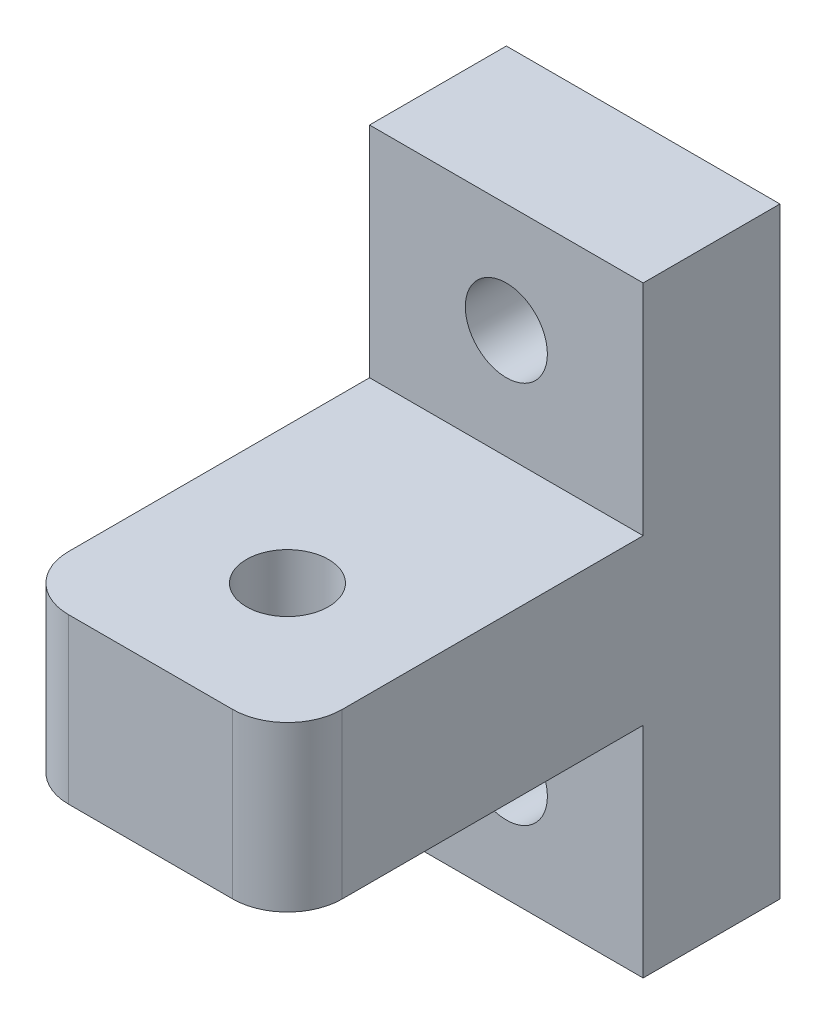
ISO-10303-21;
HEADER;
FILE_DESCRIPTION(('STEP AP214'),'2;1');
FILE_NAME('part.step','',(''),(''),'','','');
FILE_SCHEMA(('AUTOMOTIVE_DESIGN { 1 0 10303 214 1 1 1 1 }'));
ENDSEC;
DATA;
#1=APPLICATION_CONTEXT('core data for automotive mechanical design processes');
#2=APPLICATION_PROTOCOL_DEFINITION('international standard','automotive_design',2000,#1);
#3=PRODUCT_CONTEXT('',#1,'mechanical');
#4=PRODUCT('Part','Part','',(#3));
#5=PRODUCT_RELATED_PRODUCT_CATEGORY('part','',(#4));
#6=PRODUCT_DEFINITION_FORMATION('','',#4);
#7=PRODUCT_DEFINITION_CONTEXT('part definition',#1,'design');
#8=PRODUCT_DEFINITION('design','',#6,#7);
#9=PRODUCT_DEFINITION_SHAPE('','',#8);
#10=(LENGTH_UNIT() NAMED_UNIT(*) SI_UNIT(.MILLI.,.METRE.));
#11=(NAMED_UNIT(*) PLANE_ANGLE_UNIT() SI_UNIT($,.RADIAN.));
#12=(NAMED_UNIT(*) SI_UNIT($,.STERADIAN.) SOLID_ANGLE_UNIT());
#13=UNCERTAINTY_MEASURE_WITH_UNIT(LENGTH_MEASURE(1.E-05),#10,'distance_accuracy_value','');
#14=(GEOMETRIC_REPRESENTATION_CONTEXT(3) GLOBAL_UNCERTAINTY_ASSIGNED_CONTEXT((#13)) GLOBAL_UNIT_ASSIGNED_CONTEXT((#10,
#11,#12)) REPRESENTATION_CONTEXT('',''));
#15=CARTESIAN_POINT('',(0.,0.,0.));
#16=DIRECTION('',(0.,0.,1.));
#17=DIRECTION('',(1.,0.,0.));
#18=AXIS2_PLACEMENT_3D('',#15,#16,#17);
#19=CARTESIAN_POINT('',(0.,0.,5.));
#20=DIRECTION('',(0.,0.,-1.));
#21=DIRECTION('',(-1.,0.,0.));
#22=AXIS2_PLACEMENT_3D('',#19,#20,#21);
#23=PLANE('',#22);
#24=CARTESIAN_POINT('',(0.,-7.,5.));
#25=DIRECTION('',(0.,0.,1.));
#26=DIRECTION('',(1.,0.,0.));
#27=AXIS2_PLACEMENT_3D('',#24,#25,#26);
#28=CIRCLE('',#27,1.5);
#29=CARTESIAN_POINT('',(1.5,-7.,5.));
#30=VERTEX_POINT('',#29);
#31=EDGE_CURVE('E190',#30,#30,#28,.T.);
#32=ORIENTED_EDGE('',*,*,#31,.F.);
#33=EDGE_LOOP('',(#32));
#34=FACE_BOUND('',#33,.T.);
#35=DIRECTION('',(1.,0.,0.));
#36=VECTOR('',#35,1.);
#37=CARTESIAN_POINT('',(-5.,-3.,5.));
#38=LINE('',#37,#36);
#39=CARTESIAN_POINT('',(-5.,-3.,5.));
#40=VERTEX_POINT('',#39);
#41=CARTESIAN_POINT('',(5.,-3.,5.));
#42=VERTEX_POINT('',#41);
#43=EDGE_CURVE('E133',#40,#42,#38,.T.);
#44=ORIENTED_EDGE('',*,*,#43,.F.);
#45=DIRECTION('',(0.,-1.,0.));
#46=VECTOR('',#45,1.);
#47=CARTESIAN_POINT('',(-5.,-11.,5.));
#48=LINE('',#47,#46);
#49=CARTESIAN_POINT('',(-5.,-11.,5.));
#50=VERTEX_POINT('',#49);
#51=EDGE_CURVE('E130',#40,#50,#48,.T.);
#52=ORIENTED_EDGE('',*,*,#51,.T.);
#53=DIRECTION('',(1.,0.,0.));
#54=VECTOR('',#53,1.);
#55=CARTESIAN_POINT('',(-5.,-11.,5.));
#56=LINE('',#55,#54);
#57=CARTESIAN_POINT('',(5.,-11.,5.));
#58=VERTEX_POINT('',#57);
#59=EDGE_CURVE('E129',#50,#58,#56,.T.);
#60=ORIENTED_EDGE('',*,*,#59,.T.);
#61=DIRECTION('',(0.,1.,0.));
#62=VECTOR('',#61,1.);
#63=CARTESIAN_POINT('',(5.,-11.,5.));
#64=LINE('',#63,#62);
#65=EDGE_CURVE('E151',#58,#42,#64,.T.);
#66=ORIENTED_EDGE('',*,*,#65,.T.);
#67=EDGE_LOOP('',(#44,#52,#60,#66));
#68=FACE_BOUND('',#67,.T.);
#69=ADVANCED_FACE('F34',(#34,#68),#23,.F.);
#70=CARTESIAN_POINT('',(0.,7.,5.));
#71=DIRECTION('',(0.,0.,1.));
#72=DIRECTION('',(1.,0.,0.));
#73=AXIS2_PLACEMENT_3D('',#70,#71,#72);
#74=CIRCLE('',#73,1.5);
#75=CARTESIAN_POINT('',(1.5,7.,5.));
#76=VERTEX_POINT('',#75);
#77=EDGE_CURVE('E200',#76,#76,#74,.T.);
#78=ORIENTED_EDGE('',*,*,#77,.F.);
#79=EDGE_LOOP('',(#78));
#80=FACE_BOUND('',#79,.T.);
#81=DIRECTION('',(-1.,0.,0.));
#82=VECTOR('',#81,1.);
#83=CARTESIAN_POINT('',(-5.,3.,5.));
#84=LINE('',#83,#82);
#85=CARTESIAN_POINT('',(5.,3.,5.));
#86=VERTEX_POINT('',#85);
#87=CARTESIAN_POINT('',(-5.,3.,5.));
#88=VERTEX_POINT('',#87);
#89=EDGE_CURVE('E124',#86,#88,#84,.T.);
#90=ORIENTED_EDGE('',*,*,#89,.F.);
#91=CARTESIAN_POINT('',(5.,11.,5.));
#92=VERTEX_POINT('',#91);
#93=EDGE_CURVE('E154',#86,#92,#64,.T.);
#94=ORIENTED_EDGE('',*,*,#93,.T.);
#95=DIRECTION('',(-1.,0.,0.));
#96=VECTOR('',#95,1.);
#97=CARTESIAN_POINT('',(-5.,11.,5.));
#98=LINE('',#97,#96);
#99=CARTESIAN_POINT('',(-5.,11.,5.));
#100=VERTEX_POINT('',#99);
#101=EDGE_CURVE('E127',#92,#100,#98,.T.);
#102=ORIENTED_EDGE('',*,*,#101,.T.);
#103=EDGE_CURVE('E115',#100,#88,#48,.T.);
#104=ORIENTED_EDGE('',*,*,#103,.T.);
#105=EDGE_LOOP('',(#90,#94,#102,#104));
#106=FACE_BOUND('',#105,.T.);
#107=ADVANCED_FACE('F123',(#80,#106),#23,.F.);
#108=CARTESIAN_POINT('',(5.,-11.,5.));
#109=DIRECTION('',(-1.,0.,0.));
#110=DIRECTION('',(0.,0.,1.));
#111=AXIS2_PLACEMENT_3D('',#108,#109,#110);
#112=PLANE('',#111);
#113=DIRECTION('',(0.,0.,-1.));
#114=VECTOR('',#113,1.);
#115=CARTESIAN_POINT('',(5.,3.,18.));
#116=LINE('',#115,#114);
#117=CARTESIAN_POINT('',(5.,3.,16.));
#118=VERTEX_POINT('',#117);
#119=EDGE_CURVE('E118',#118,#86,#116,.T.);
#120=ORIENTED_EDGE('',*,*,#119,.F.);
#121=DIRECTION('',(0.,1.,0.));
#122=VECTOR('',#121,1.);
#123=CARTESIAN_POINT('',(5.,-11.,16.));
#124=LINE('',#123,#122);
#125=CARTESIAN_POINT('',(5.,-3.,16.));
#126=VERTEX_POINT('',#125);
#127=EDGE_CURVE('E11',#118,#126,#124,.F.);
#128=ORIENTED_EDGE('',*,*,#127,.T.);
#129=DIRECTION('',(0.,0.,-1.));
#130=VECTOR('',#129,1.);
#131=CARTESIAN_POINT('',(5.,-3.,18.));
#132=LINE('',#131,#130);
#133=EDGE_CURVE('E146',#126,#42,#132,.T.);
#134=ORIENTED_EDGE('',*,*,#133,.T.);
#135=ORIENTED_EDGE('',*,*,#65,.F.);
#136=DIRECTION('',(0.,0.,-1.));
#137=VECTOR('',#136,1.);
#138=CARTESIAN_POINT('',(5.,-11.,5.));
#139=LINE('',#138,#137);
#140=CARTESIAN_POINT('',(5.,-11.,0.));
#141=VERTEX_POINT('',#140);
#142=EDGE_CURVE('E157',#58,#141,#139,.T.);
#143=ORIENTED_EDGE('',*,*,#142,.T.);
#144=DIRECTION('',(0.,1.,0.));
#145=VECTOR('',#144,1.);
#146=CARTESIAN_POINT('',(5.,-11.,0.));
#147=LINE('',#146,#145);
#148=CARTESIAN_POINT('',(5.,11.,0.));
#149=VERTEX_POINT('',#148);
#150=EDGE_CURVE('E150',#141,#149,#147,.T.);
#151=ORIENTED_EDGE('',*,*,#150,.T.);
#152=DIRECTION('',(0.,0.,-1.));
#153=VECTOR('',#152,1.);
#154=CARTESIAN_POINT('',(5.,11.,5.));
#155=LINE('',#154,#153);
#156=EDGE_CURVE('E173',#92,#149,#155,.T.);
#157=ORIENTED_EDGE('',*,*,#156,.F.);
#158=ORIENTED_EDGE('',*,*,#93,.F.);
#159=EDGE_LOOP('',(#120,#128,#134,#135,#143,#151,#157,#158));
#160=FACE_BOUND('',#159,.T.);
#161=ADVANCED_FACE('F215',(#160),#112,.F.);
#162=CARTESIAN_POINT('',(-5.,11.,5.));
#163=DIRECTION('',(0.,-1.,0.));
#164=DIRECTION('',(0.,0.,-1.));
#165=AXIS2_PLACEMENT_3D('',#162,#163,#164);
#166=PLANE('',#165);
#167=DIRECTION('',(-1.,0.,0.));
#168=VECTOR('',#167,1.);
#169=CARTESIAN_POINT('',(-5.,11.,0.));
#170=LINE('',#169,#168);
#171=CARTESIAN_POINT('',(-5.,11.,0.));
#172=VERTEX_POINT('',#171);
#173=EDGE_CURVE('E160',#149,#172,#170,.T.);
#174=ORIENTED_EDGE('',*,*,#173,.T.);
#175=DIRECTION('',(0.,0.,-1.));
#176=VECTOR('',#175,1.);
#177=CARTESIAN_POINT('',(-5.,11.,5.));
#178=LINE('',#177,#176);
#179=EDGE_CURVE('E171',#100,#172,#178,.T.);
#180=ORIENTED_EDGE('',*,*,#179,.F.);
#181=ORIENTED_EDGE('',*,*,#101,.F.);
#182=ORIENTED_EDGE('',*,*,#156,.T.);
#183=EDGE_LOOP('',(#174,#180,#181,#182));
#184=FACE_BOUND('',#183,.T.);
#185=ADVANCED_FACE('F233',(#184),#166,.F.);
#186=CARTESIAN_POINT('',(-5.,-11.,5.));
#187=DIRECTION('',(1.,0.,0.));
#188=DIRECTION('',(0.,0.,-1.));
#189=AXIS2_PLACEMENT_3D('',#186,#187,#188);
#190=PLANE('',#189);
#191=DIRECTION('',(0.,0.,-1.));
#192=VECTOR('',#191,1.);
#193=CARTESIAN_POINT('',(-5.,-3.,18.));
#194=LINE('',#193,#192);
#195=CARTESIAN_POINT('',(-5.,-3.,16.));
#196=VERTEX_POINT('',#195);
#197=EDGE_CURVE('E119',#196,#40,#194,.T.);
#198=ORIENTED_EDGE('',*,*,#197,.F.);
#199=DIRECTION('',(0.,-1.,0.));
#200=VECTOR('',#199,1.);
#201=CARTESIAN_POINT('',(-5.,-11.,16.));
#202=LINE('',#201,#200);
#203=CARTESIAN_POINT('',(-5.,3.,16.));
#204=VERTEX_POINT('',#203);
#205=EDGE_CURVE('E59',#196,#204,#202,.F.);
#206=ORIENTED_EDGE('',*,*,#205,.T.);
#207=DIRECTION('',(0.,0.,-1.));
#208=VECTOR('',#207,1.);
#209=CARTESIAN_POINT('',(-5.,3.,18.));
#210=LINE('',#209,#208);
#211=EDGE_CURVE('E111',#204,#88,#210,.T.);
#212=ORIENTED_EDGE('',*,*,#211,.T.);
#213=ORIENTED_EDGE('',*,*,#103,.F.);
#214=ORIENTED_EDGE('',*,*,#179,.T.);
#215=DIRECTION('',(0.,-1.,0.));
#216=VECTOR('',#215,1.);
#217=CARTESIAN_POINT('',(-5.,-11.,0.));
#218=LINE('',#217,#216);
#219=CARTESIAN_POINT('',(-5.,-11.,0.));
#220=VERTEX_POINT('',#219);
#221=EDGE_CURVE('E162',#172,#220,#218,.T.);
#222=ORIENTED_EDGE('',*,*,#221,.T.);
#223=DIRECTION('',(0.,0.,-1.));
#224=VECTOR('',#223,1.);
#225=CARTESIAN_POINT('',(-5.,-11.,5.));
#226=LINE('',#225,#224);
#227=EDGE_CURVE('E168',#50,#220,#226,.T.);
#228=ORIENTED_EDGE('',*,*,#227,.F.);
#229=ORIENTED_EDGE('',*,*,#51,.F.);
#230=EDGE_LOOP('',(#198,#206,#212,#213,#214,#222,#228,#229));
#231=FACE_BOUND('',#230,.T.);
#232=ADVANCED_FACE('F113',(#231),#190,.F.);
#233=CARTESIAN_POINT('',(-5.,-11.,5.));
#234=DIRECTION('',(0.,1.,0.));
#235=DIRECTION('',(0.,0.,1.));
#236=AXIS2_PLACEMENT_3D('',#233,#234,#235);
#237=PLANE('',#236);
#238=DIRECTION('',(1.,0.,0.));
#239=VECTOR('',#238,1.);
#240=CARTESIAN_POINT('',(-5.,-11.,0.));
#241=LINE('',#240,#239);
#242=EDGE_CURVE('E164',#220,#141,#241,.T.);
#243=ORIENTED_EDGE('',*,*,#242,.T.);
#244=ORIENTED_EDGE('',*,*,#142,.F.);
#245=ORIENTED_EDGE('',*,*,#59,.F.);
#246=ORIENTED_EDGE('',*,*,#227,.T.);
#247=EDGE_LOOP('',(#243,#244,#245,#246));
#248=FACE_BOUND('',#247,.T.);
#249=ADVANCED_FACE('F227',(#248),#237,.F.);
#250=CARTESIAN_POINT('',(0.,0.,0.));
#251=DIRECTION('',(0.,0.,-1.));
#252=DIRECTION('',(-1.,0.,0.));
#253=AXIS2_PLACEMENT_3D('',#250,#251,#252);
#254=PLANE('',#253);
#255=CARTESIAN_POINT('',(0.,7.,0.));
#256=DIRECTION('',(0.,0.,-1.));
#257=DIRECTION('',(-1.,0.,0.));
#258=AXIS2_PLACEMENT_3D('',#255,#256,#257);
#259=CIRCLE('',#258,1.5);
#260=CARTESIAN_POINT('',(1.5,7.,0.));
#261=VERTEX_POINT('',#260);
#262=EDGE_CURVE('E38',#261,#261,#259,.T.);
#263=ORIENTED_EDGE('',*,*,#262,.F.);
#264=EDGE_LOOP('',(#263));
#265=FACE_BOUND('',#264,.T.);
#266=CARTESIAN_POINT('',(0.,-7.,0.));
#267=DIRECTION('',(0.,0.,-1.));
#268=DIRECTION('',(-1.,0.,0.));
#269=AXIS2_PLACEMENT_3D('',#266,#267,#268);
#270=CIRCLE('',#269,1.5);
#271=CARTESIAN_POINT('',(1.5,-7.,0.));
#272=VERTEX_POINT('',#271);
#273=EDGE_CURVE('E188',#272,#272,#270,.T.);
#274=ORIENTED_EDGE('',*,*,#273,.F.);
#275=EDGE_LOOP('',(#274));
#276=FACE_BOUND('',#275,.T.);
#277=ORIENTED_EDGE('',*,*,#150,.F.);
#278=ORIENTED_EDGE('',*,*,#242,.F.);
#279=ORIENTED_EDGE('',*,*,#221,.F.);
#280=ORIENTED_EDGE('',*,*,#173,.F.);
#281=EDGE_LOOP('',(#277,#278,#279,#280));
#282=FACE_BOUND('',#281,.T.);
#283=ADVANCED_FACE('F231',(#265,#276,#282),#254,.T.);
#284=CARTESIAN_POINT('',(-5.,3.,18.));
#285=DIRECTION('',(0.,-1.,0.));
#286=DIRECTION('',(0.,0.,-1.));
#287=AXIS2_PLACEMENT_3D('',#284,#285,#286);
#288=PLANE('',#287);
#289=CARTESIAN_POINT('',(0.,3.,13.));
#290=DIRECTION('',(0.,-1.,0.));
#291=DIRECTION('',(0.,0.,-1.));
#292=AXIS2_PLACEMENT_3D('',#289,#290,#291);
#293=CIRCLE('',#292,1.5);
#294=CARTESIAN_POINT('',(0.,3.,11.5));
#295=VERTEX_POINT('',#294);
#296=EDGE_CURVE('E134',#295,#295,#293,.T.);
#297=ORIENTED_EDGE('',*,*,#296,.T.);
#298=EDGE_LOOP('',(#297));
#299=FACE_BOUND('',#298,.T.);
#300=ORIENTED_EDGE('',*,*,#211,.F.);
#301=CARTESIAN_POINT('',(-3.,3.,16.));
#302=DIRECTION('',(0.,-1.,0.));
#303=DIRECTION('',(0.,0.,-1.));
#304=AXIS2_PLACEMENT_3D('',#301,#302,#303);
#305=CIRCLE('',#304,2.);
#306=CARTESIAN_POINT('',(-3.,3.,18.));
#307=VERTEX_POINT('',#306);
#308=EDGE_CURVE('E43',#204,#307,#305,.F.);
#309=ORIENTED_EDGE('',*,*,#308,.T.);
#310=DIRECTION('',(-1.,0.,0.));
#311=VECTOR('',#310,1.);
#312=CARTESIAN_POINT('',(-5.,3.,18.));
#313=LINE('',#312,#311);
#314=CARTESIAN_POINT('',(3.,3.,18.));
#315=VERTEX_POINT('',#314);
#316=EDGE_CURVE('E137',#315,#307,#313,.T.);
#317=ORIENTED_EDGE('',*,*,#316,.F.);
#318=CARTESIAN_POINT('',(3.,3.,16.));
#319=DIRECTION('',(0.,-1.,0.));
#320=DIRECTION('',(0.,0.,-1.));
#321=AXIS2_PLACEMENT_3D('',#318,#319,#320);
#322=CIRCLE('',#321,2.);
#323=EDGE_CURVE('E51',#315,#118,#322,.F.);
#324=ORIENTED_EDGE('',*,*,#323,.T.);
#325=ORIENTED_EDGE('',*,*,#119,.T.);
#326=ORIENTED_EDGE('',*,*,#89,.T.);
#327=EDGE_LOOP('',(#300,#309,#317,#324,#325,#326));
#328=FACE_BOUND('',#327,.T.);
#329=ADVANCED_FACE('F132',(#299,#328),#288,.F.);
#330=CARTESIAN_POINT('',(-5.,-3.,18.));
#331=DIRECTION('',(0.,1.,0.));
#332=DIRECTION('',(0.,0.,1.));
#333=AXIS2_PLACEMENT_3D('',#330,#331,#332);
#334=PLANE('',#333);
#335=CARTESIAN_POINT('',(0.,-3.,13.));
#336=DIRECTION('',(0.,-1.,0.));
#337=DIRECTION('',(0.,0.,-1.));
#338=AXIS2_PLACEMENT_3D('',#335,#336,#337);
#339=CIRCLE('',#338,1.5);
#340=CARTESIAN_POINT('',(0.,-3.,11.5));
#341=VERTEX_POINT('',#340);
#342=EDGE_CURVE('E140',#341,#341,#339,.T.);
#343=ORIENTED_EDGE('',*,*,#342,.F.);
#344=EDGE_LOOP('',(#343));
#345=FACE_BOUND('',#344,.T.);
#346=DIRECTION('',(1.,0.,0.));
#347=VECTOR('',#346,1.);
#348=CARTESIAN_POINT('',(-5.,-3.,18.));
#349=LINE('',#348,#347);
#350=CARTESIAN_POINT('',(-3.,-3.,18.));
#351=VERTEX_POINT('',#350);
#352=CARTESIAN_POINT('',(3.,-3.,18.));
#353=VERTEX_POINT('',#352);
#354=EDGE_CURVE('E143',#351,#353,#349,.T.);
#355=ORIENTED_EDGE('',*,*,#354,.F.);
#356=CARTESIAN_POINT('',(-3.,-3.,16.));
#357=DIRECTION('',(0.,1.,0.));
#358=DIRECTION('',(0.,0.,1.));
#359=AXIS2_PLACEMENT_3D('',#356,#357,#358);
#360=CIRCLE('',#359,2.);
#361=EDGE_CURVE('E184',#351,#196,#360,.F.);
#362=ORIENTED_EDGE('',*,*,#361,.T.);
#363=ORIENTED_EDGE('',*,*,#197,.T.);
#364=ORIENTED_EDGE('',*,*,#43,.T.);
#365=ORIENTED_EDGE('',*,*,#133,.F.);
#366=CARTESIAN_POINT('',(3.,-3.,16.));
#367=DIRECTION('',(0.,1.,0.));
#368=DIRECTION('',(0.,0.,1.));
#369=AXIS2_PLACEMENT_3D('',#366,#367,#368);
#370=CIRCLE('',#369,2.);
#371=EDGE_CURVE('E182',#126,#353,#370,.F.);
#372=ORIENTED_EDGE('',*,*,#371,.T.);
#373=EDGE_LOOP('',(#355,#362,#363,#364,#365,#372));
#374=FACE_BOUND('',#373,.T.);
#375=ADVANCED_FACE('F217',(#345,#374),#334,.F.);
#376=CARTESIAN_POINT('',(0.,0.,18.));
#377=DIRECTION('',(0.,0.,-1.));
#378=DIRECTION('',(-1.,0.,0.));
#379=AXIS2_PLACEMENT_3D('',#376,#377,#378);
#380=PLANE('',#379);
#381=ORIENTED_EDGE('',*,*,#316,.T.);
#382=DIRECTION('',(0.,-1.,0.));
#383=VECTOR('',#382,1.);
#384=CARTESIAN_POINT('',(-3.,0.,18.));
#385=LINE('',#384,#383);
#386=EDGE_CURVE('E179',#307,#351,#385,.T.);
#387=ORIENTED_EDGE('',*,*,#386,.T.);
#388=ORIENTED_EDGE('',*,*,#354,.T.);
#389=DIRECTION('',(0.,1.,0.));
#390=VECTOR('',#389,1.);
#391=CARTESIAN_POINT('',(3.,0.,18.));
#392=LINE('',#391,#390);
#393=EDGE_CURVE('E176',#353,#315,#392,.T.);
#394=ORIENTED_EDGE('',*,*,#393,.T.);
#395=EDGE_LOOP('',(#381,#387,#388,#394));
#396=FACE_BOUND('',#395,.T.);
#397=ADVANCED_FACE('F208',(#396),#380,.F.);
#398=CARTESIAN_POINT('',(-3.,0.,16.));
#399=DIRECTION('',(0.,-1.,0.));
#400=DIRECTION('',(0.,0.,-1.));
#401=AXIS2_PLACEMENT_3D('',#398,#399,#400);
#402=CYLINDRICAL_SURFACE('',#401,2.);
#403=ORIENTED_EDGE('',*,*,#308,.F.);
#404=ORIENTED_EDGE('',*,*,#205,.F.);
#405=ORIENTED_EDGE('',*,*,#361,.F.);
#406=ORIENTED_EDGE('',*,*,#386,.F.);
#407=EDGE_LOOP('',(#403,#404,#405,#406));
#408=FACE_BOUND('',#407,.T.);
#409=ADVANCED_FACE('F287',(#408),#402,.T.);
#410=CARTESIAN_POINT('',(3.,0.,16.));
#411=DIRECTION('',(0.,1.,0.));
#412=DIRECTION('',(0.,0.,1.));
#413=AXIS2_PLACEMENT_3D('',#410,#411,#412);
#414=CYLINDRICAL_SURFACE('',#413,2.);
#415=ORIENTED_EDGE('',*,*,#371,.F.);
#416=ORIENTED_EDGE('',*,*,#127,.F.);
#417=ORIENTED_EDGE('',*,*,#323,.F.);
#418=ORIENTED_EDGE('',*,*,#393,.F.);
#419=EDGE_LOOP('',(#415,#416,#417,#418));
#420=FACE_BOUND('',#419,.T.);
#421=ADVANCED_FACE('F36',(#420),#414,.T.);
#422=CARTESIAN_POINT('',(0.,10.,13.));
#423=DIRECTION('',(0.,-1.,0.));
#424=DIRECTION('',(0.,0.,-1.));
#425=AXIS2_PLACEMENT_3D('',#422,#423,#424);
#426=CYLINDRICAL_SURFACE('',#425,1.5);
#427=CARTESIAN_POINT('',(0.,-3.,11.5));
#428=CARTESIAN_POINT('',(0.,-2.9375,11.5));
#429=CARTESIAN_POINT('',(0.,-2.875,11.5));
#430=CARTESIAN_POINT('',(0.,-2.75,11.5));
#431=CARTESIAN_POINT('',(0.,-2.6875,11.5));
#432=CARTESIAN_POINT('',(0.,-2.5625,11.5));
#433=CARTESIAN_POINT('',(0.,-2.5,11.5));
#434=CARTESIAN_POINT('',(0.,-2.375,11.5));
#435=CARTESIAN_POINT('',(0.,-2.3125,11.5));
#436=CARTESIAN_POINT('',(0.,-2.1875,11.5));
#437=CARTESIAN_POINT('',(0.,-2.125,11.5));
#438=CARTESIAN_POINT('',(0.,-2.,11.5));
#439=CARTESIAN_POINT('',(0.,-1.9375,11.5));
#440=CARTESIAN_POINT('',(0.,-1.8125,11.5));
#441=CARTESIAN_POINT('',(0.,-1.75,11.5));
#442=CARTESIAN_POINT('',(0.,-1.625,11.5));
#443=CARTESIAN_POINT('',(0.,-1.5625,11.5));
#444=CARTESIAN_POINT('',(0.,-1.4375,11.5));
#445=CARTESIAN_POINT('',(0.,-1.375,11.5));
#446=CARTESIAN_POINT('',(0.,-1.25,11.5));
#447=CARTESIAN_POINT('',(0.,-1.1875,11.5));
#448=CARTESIAN_POINT('',(0.,-1.0625,11.5));
#449=CARTESIAN_POINT('',(0.,-1.,11.5));
#450=CARTESIAN_POINT('',(0.,-0.875000000000001,11.5));
#451=CARTESIAN_POINT('',(0.,-0.812500000000001,11.5));
#452=CARTESIAN_POINT('',(0.,-0.687500000000001,11.5));
#453=CARTESIAN_POINT('',(0.,-0.625000000000001,11.5));
#454=CARTESIAN_POINT('',(0.,-0.5,11.5));
#455=CARTESIAN_POINT('',(0.,-0.4375,11.5));
#456=CARTESIAN_POINT('',(0.,-0.3125,11.5));
#457=CARTESIAN_POINT('',(0.,-0.25,11.5));
#458=CARTESIAN_POINT('',(0.,-0.125,11.5));
#459=CARTESIAN_POINT('',(0.,-0.0625000000000001,11.5));
#460=CARTESIAN_POINT('',(0.,0.0625000000000001,11.5));
#461=CARTESIAN_POINT('',(0.,0.125,11.5));
#462=CARTESIAN_POINT('',(0.,0.25,11.5));
#463=CARTESIAN_POINT('',(0.,0.3125,11.5));
#464=CARTESIAN_POINT('',(0.,0.4375,11.5));
#465=CARTESIAN_POINT('',(0.,0.5,11.5));
#466=CARTESIAN_POINT('',(0.,0.625000000000001,11.5));
#467=CARTESIAN_POINT('',(0.,0.687500000000001,11.5));
#468=CARTESIAN_POINT('',(0.,0.8125,11.5));
#469=CARTESIAN_POINT('',(0.,0.875,11.5));
#470=CARTESIAN_POINT('',(0.,0.999999999999999,11.5));
#471=CARTESIAN_POINT('',(0.,1.0625,11.5));
#472=CARTESIAN_POINT('',(0.,1.1875,11.5));
#473=CARTESIAN_POINT('',(0.,1.25,11.5));
#474=CARTESIAN_POINT('',(0.,1.375,11.5));
#475=CARTESIAN_POINT('',(0.,1.4375,11.5));
#476=CARTESIAN_POINT('',(0.,1.5625,11.5));
#477=CARTESIAN_POINT('',(0.,1.625,11.5));
#478=CARTESIAN_POINT('',(0.,1.75,11.5));
#479=CARTESIAN_POINT('',(0.,1.8125,11.5));
#480=CARTESIAN_POINT('',(0.,1.9375,11.5));
#481=CARTESIAN_POINT('',(0.,2.,11.5));
#482=CARTESIAN_POINT('',(0.,2.125,11.5));
#483=CARTESIAN_POINT('',(0.,2.1875,11.5));
#484=CARTESIAN_POINT('',(0.,2.3125,11.5));
#485=CARTESIAN_POINT('',(0.,2.375,11.5));
#486=CARTESIAN_POINT('',(0.,2.5,11.5));
#487=CARTESIAN_POINT('',(0.,2.5625,11.5));
#488=CARTESIAN_POINT('',(0.,2.6875,11.5));
#489=CARTESIAN_POINT('',(0.,2.75,11.5));
#490=CARTESIAN_POINT('',(0.,2.875,11.5));
#491=CARTESIAN_POINT('',(0.,2.9375,11.5));
#492=CARTESIAN_POINT('',(0.,3.,11.5));
#493=B_SPLINE_CURVE_WITH_KNOTS('',3,(#427,#428,#429,#430,#431,#432,#433,#434,#435,#436,#437,
#438,#439,#440,#441,#442,#443,#444,#445,#446,#447,#448,#449,#450,#451,#452,#453,#454,#455,#456,
#457,#458,#459,#460,#461,#462,#463,#464,#465,#466,#467,#468,#469,#470,#471,#472,#473,#474,#475,
#476,#477,#478,#479,#480,#481,#482,#483,#484,#485,#486,#487,#488,#489,#490,#491,#492),
.UNSPECIFIED.,.F.,.F.,(4,2,2,2,2,2,2,2,2,2,2,2,2,2,2,2,2,2,2,2,2,2,2,2,2,2,2,2,2,2,2,2,4),(0.,
0.1875,0.375,0.5625,0.750000000000001,0.937500000000001,1.125,1.3125,1.5,1.6875,1.875,2.0625,
2.25,2.4375,2.625,2.8125,3.,3.1875,3.375,3.5625,3.75,3.9375,4.125,4.3125,4.5,4.6875,4.875,
5.0625,5.25,5.4375,5.625,5.8125,6.),.UNSPECIFIED.);
#494=EDGE_CURVE('BSEAM299',#341,#295,#493,.T.);
#495=ORIENTED_EDGE('',*,*,#342,.T.);
#496=ORIENTED_EDGE('',*,*,#296,.F.);
#497=ORIENTED_EDGE('',*,*,#494,.T.);
#498=ORIENTED_EDGE('',*,*,#494,.F.);
#499=EDGE_LOOP('',(#495,#497,#496,#498));
#500=FACE_BOUND('',#499,.T.);
#501=ADVANCED_FACE('F299',(#500),#426,.F.);
#502=CARTESIAN_POINT('',(0.,-7.,-8.));
#503=DIRECTION('',(0.,0.,1.));
#504=DIRECTION('',(1.,0.,0.));
#505=AXIS2_PLACEMENT_3D('',#502,#503,#504);
#506=CYLINDRICAL_SURFACE('',#505,1.5);
#507=CARTESIAN_POINT('',(1.5,-7.,0.));
#508=CARTESIAN_POINT('',(1.5,-7.,0.0520833333333351));
#509=CARTESIAN_POINT('',(1.5,-7.,0.104166666666669));
#510=CARTESIAN_POINT('',(1.5,-7.,0.208333333333335));
#511=CARTESIAN_POINT('',(1.5,-7.,0.260416666666669));
#512=CARTESIAN_POINT('',(1.5,-7.,0.364583333333335));
#513=CARTESIAN_POINT('',(1.5,-7.,0.416666666666669));
#514=CARTESIAN_POINT('',(1.5,-7.,0.520833333333335));
#515=CARTESIAN_POINT('',(1.5,-7.,0.572916666666669));
#516=CARTESIAN_POINT('',(1.5,-7.,0.677083333333335));
#517=CARTESIAN_POINT('',(1.5,-7.,0.729166666666668));
#518=CARTESIAN_POINT('',(1.5,-7.,0.833333333333334));
#519=CARTESIAN_POINT('',(1.5,-7.,0.885416666666668));
#520=CARTESIAN_POINT('',(1.5,-7.,0.989583333333334));
#521=CARTESIAN_POINT('',(1.5,-7.,1.04166666666667));
#522=CARTESIAN_POINT('',(1.5,-7.,1.14583333333333));
#523=CARTESIAN_POINT('',(1.5,-7.,1.19791666666667));
#524=CARTESIAN_POINT('',(1.5,-7.,1.30208333333333));
#525=CARTESIAN_POINT('',(1.5,-7.,1.35416666666667));
#526=CARTESIAN_POINT('',(1.5,-7.,1.45833333333333));
#527=CARTESIAN_POINT('',(1.5,-7.,1.51041666666667));
#528=CARTESIAN_POINT('',(1.5,-7.,1.61458333333333));
#529=CARTESIAN_POINT('',(1.5,-7.,1.66666666666667));
#530=CARTESIAN_POINT('',(1.5,-7.,1.77083333333333));
#531=CARTESIAN_POINT('',(1.5,-7.,1.82291666666667));
#532=CARTESIAN_POINT('',(1.5,-7.,1.92708333333333));
#533=CARTESIAN_POINT('',(1.5,-7.,1.97916666666667));
#534=CARTESIAN_POINT('',(1.5,-7.,2.08333333333333));
#535=CARTESIAN_POINT('',(1.5,-7.,2.13541666666667));
#536=CARTESIAN_POINT('',(1.5,-7.,2.23958333333333));
#537=CARTESIAN_POINT('',(1.5,-7.,2.29166666666667));
#538=CARTESIAN_POINT('',(1.5,-7.,2.39583333333333));
#539=CARTESIAN_POINT('',(1.5,-7.,2.44791666666667));
#540=CARTESIAN_POINT('',(1.5,-7.,2.55208333333333));
#541=CARTESIAN_POINT('',(1.5,-7.,2.60416666666667));
#542=CARTESIAN_POINT('',(1.5,-7.,2.70833333333333));
#543=CARTESIAN_POINT('',(1.5,-7.,2.76041666666667));
#544=CARTESIAN_POINT('',(1.5,-7.,2.86458333333333));
#545=CARTESIAN_POINT('',(1.5,-7.,2.91666666666667));
#546=CARTESIAN_POINT('',(1.5,-7.,3.02083333333333));
#547=CARTESIAN_POINT('',(1.5,-7.,3.07291666666667));
#548=CARTESIAN_POINT('',(1.5,-7.,3.17708333333333));
#549=CARTESIAN_POINT('',(1.5,-7.,3.22916666666667));
#550=CARTESIAN_POINT('',(1.5,-7.,3.33333333333333));
#551=CARTESIAN_POINT('',(1.5,-7.,3.38541666666667));
#552=CARTESIAN_POINT('',(1.5,-7.,3.48958333333333));
#553=CARTESIAN_POINT('',(1.5,-7.,3.54166666666667));
#554=CARTESIAN_POINT('',(1.5,-7.,3.64583333333333));
#555=CARTESIAN_POINT('',(1.5,-7.,3.69791666666667));
#556=CARTESIAN_POINT('',(1.5,-7.,3.80208333333333));
#557=CARTESIAN_POINT('',(1.5,-7.,3.85416666666667));
#558=CARTESIAN_POINT('',(1.5,-7.,3.95833333333333));
#559=CARTESIAN_POINT('',(1.5,-7.,4.01041666666667));
#560=CARTESIAN_POINT('',(1.5,-7.,4.11458333333333));
#561=CARTESIAN_POINT('',(1.5,-7.,4.16666666666667));
#562=CARTESIAN_POINT('',(1.5,-7.,4.27083333333333));
#563=CARTESIAN_POINT('',(1.5,-7.,4.32291666666667));
#564=CARTESIAN_POINT('',(1.5,-7.,4.42708333333333));
#565=CARTESIAN_POINT('',(1.5,-7.,4.47916666666667));
#566=CARTESIAN_POINT('',(1.5,-7.,4.58333333333333));
#567=CARTESIAN_POINT('',(1.5,-7.,4.63541666666667));
#568=CARTESIAN_POINT('',(1.5,-7.,4.73958333333333));
#569=CARTESIAN_POINT('',(1.5,-7.,4.79166666666667));
#570=CARTESIAN_POINT('',(1.5,-7.,4.89583333333333));
#571=CARTESIAN_POINT('',(1.5,-7.,4.94791666666667));
#572=CARTESIAN_POINT('',(1.5,-7.,5.));
#573=B_SPLINE_CURVE_WITH_KNOTS('',3,(#507,#508,#509,#510,#511,#512,#513,#514,#515,#516,#517,
#518,#519,#520,#521,#522,#523,#524,#525,#526,#527,#528,#529,#530,#531,#532,#533,#534,#535,#536,
#537,#538,#539,#540,#541,#542,#543,#544,#545,#546,#547,#548,#549,#550,#551,#552,#553,#554,#555,
#556,#557,#558,#559,#560,#561,#562,#563,#564,#565,#566,#567,#568,#569,#570,#571,#572),
.UNSPECIFIED.,.F.,.F.,(4,2,2,2,2,2,2,2,2,2,2,2,2,2,2,2,2,2,2,2,2,2,2,2,2,2,2,2,2,2,2,2,4),(0.,
0.15625,0.3125,0.46875,0.625000000000001,0.781249999999999,0.937499999999999,1.09375,1.25,
1.40625,1.5625,1.71875,1.875,2.03125,2.1875,2.34375,2.5,2.65625,2.8125,2.96875,3.125,3.28125,
3.4375,3.59375,3.75,3.90625,4.0625,4.21875,4.375,4.53125,4.6875,4.84375,5.),.UNSPECIFIED.);
#574=EDGE_CURVE('BSEAM304',#272,#30,#573,.T.);
#575=ORIENTED_EDGE('',*,*,#273,.T.);
#576=ORIENTED_EDGE('',*,*,#31,.T.);
#577=ORIENTED_EDGE('',*,*,#574,.T.);
#578=ORIENTED_EDGE('',*,*,#574,.F.);
#579=EDGE_LOOP('',(#575,#577,#576,#578));
#580=FACE_BOUND('',#579,.T.);
#581=ADVANCED_FACE('F304',(#580),#506,.F.);
#582=CARTESIAN_POINT('',(0.,7.,-8.));
#583=DIRECTION('',(0.,0.,1.));
#584=DIRECTION('',(1.,0.,0.));
#585=AXIS2_PLACEMENT_3D('',#582,#583,#584);
#586=CYLINDRICAL_SURFACE('',#585,1.5);
#587=CARTESIAN_POINT('',(1.5,7.,0.));
#588=CARTESIAN_POINT('',(1.5,7.,0.0520833333333351));
#589=CARTESIAN_POINT('',(1.5,7.,0.104166666666669));
#590=CARTESIAN_POINT('',(1.5,7.,0.208333333333335));
#591=CARTESIAN_POINT('',(1.5,7.,0.260416666666669));
#592=CARTESIAN_POINT('',(1.5,7.,0.364583333333335));
#593=CARTESIAN_POINT('',(1.5,7.,0.416666666666669));
#594=CARTESIAN_POINT('',(1.5,7.,0.520833333333335));
#595=CARTESIAN_POINT('',(1.5,7.,0.572916666666669));
#596=CARTESIAN_POINT('',(1.5,7.,0.677083333333335));
#597=CARTESIAN_POINT('',(1.5,7.,0.729166666666668));
#598=CARTESIAN_POINT('',(1.5,7.,0.833333333333334));
#599=CARTESIAN_POINT('',(1.5,7.,0.885416666666668));
#600=CARTESIAN_POINT('',(1.5,7.,0.989583333333334));
#601=CARTESIAN_POINT('',(1.5,7.,1.04166666666667));
#602=CARTESIAN_POINT('',(1.5,7.,1.14583333333333));
#603=CARTESIAN_POINT('',(1.5,7.,1.19791666666667));
#604=CARTESIAN_POINT('',(1.5,7.,1.30208333333333));
#605=CARTESIAN_POINT('',(1.5,7.,1.35416666666667));
#606=CARTESIAN_POINT('',(1.5,7.,1.45833333333333));
#607=CARTESIAN_POINT('',(1.5,7.,1.51041666666667));
#608=CARTESIAN_POINT('',(1.5,7.,1.61458333333333));
#609=CARTESIAN_POINT('',(1.5,7.,1.66666666666667));
#610=CARTESIAN_POINT('',(1.5,7.,1.77083333333333));
#611=CARTESIAN_POINT('',(1.5,7.,1.82291666666667));
#612=CARTESIAN_POINT('',(1.5,7.,1.92708333333333));
#613=CARTESIAN_POINT('',(1.5,7.,1.97916666666667));
#614=CARTESIAN_POINT('',(1.5,7.,2.08333333333333));
#615=CARTESIAN_POINT('',(1.5,7.,2.13541666666667));
#616=CARTESIAN_POINT('',(1.5,7.,2.23958333333333));
#617=CARTESIAN_POINT('',(1.5,7.,2.29166666666667));
#618=CARTESIAN_POINT('',(1.5,7.,2.39583333333333));
#619=CARTESIAN_POINT('',(1.5,7.,2.44791666666667));
#620=CARTESIAN_POINT('',(1.5,7.,2.55208333333333));
#621=CARTESIAN_POINT('',(1.5,7.,2.60416666666667));
#622=CARTESIAN_POINT('',(1.5,7.,2.70833333333333));
#623=CARTESIAN_POINT('',(1.5,7.,2.76041666666667));
#624=CARTESIAN_POINT('',(1.5,7.,2.86458333333333));
#625=CARTESIAN_POINT('',(1.5,7.,2.91666666666667));
#626=CARTESIAN_POINT('',(1.5,7.,3.02083333333333));
#627=CARTESIAN_POINT('',(1.5,7.,3.07291666666667));
#628=CARTESIAN_POINT('',(1.5,7.,3.17708333333333));
#629=CARTESIAN_POINT('',(1.5,7.,3.22916666666667));
#630=CARTESIAN_POINT('',(1.5,7.,3.33333333333333));
#631=CARTESIAN_POINT('',(1.5,7.,3.38541666666667));
#632=CARTESIAN_POINT('',(1.5,7.,3.48958333333333));
#633=CARTESIAN_POINT('',(1.5,7.,3.54166666666667));
#634=CARTESIAN_POINT('',(1.5,7.,3.64583333333333));
#635=CARTESIAN_POINT('',(1.5,7.,3.69791666666667));
#636=CARTESIAN_POINT('',(1.5,7.,3.80208333333333));
#637=CARTESIAN_POINT('',(1.5,7.,3.85416666666667));
#638=CARTESIAN_POINT('',(1.5,7.,3.95833333333333));
#639=CARTESIAN_POINT('',(1.5,7.,4.01041666666667));
#640=CARTESIAN_POINT('',(1.5,7.,4.11458333333333));
#641=CARTESIAN_POINT('',(1.5,7.,4.16666666666667));
#642=CARTESIAN_POINT('',(1.5,7.,4.27083333333333));
#643=CARTESIAN_POINT('',(1.5,7.,4.32291666666667));
#644=CARTESIAN_POINT('',(1.5,7.,4.42708333333333));
#645=CARTESIAN_POINT('',(1.5,7.,4.47916666666667));
#646=CARTESIAN_POINT('',(1.5,7.,4.58333333333333));
#647=CARTESIAN_POINT('',(1.5,7.,4.63541666666667));
#648=CARTESIAN_POINT('',(1.5,7.,4.73958333333333));
#649=CARTESIAN_POINT('',(1.5,7.,4.79166666666667));
#650=CARTESIAN_POINT('',(1.5,7.,4.89583333333333));
#651=CARTESIAN_POINT('',(1.5,7.,4.94791666666667));
#652=CARTESIAN_POINT('',(1.5,7.,5.));
#653=B_SPLINE_CURVE_WITH_KNOTS('',3,(#587,#588,#589,#590,#591,#592,#593,#594,#595,#596,#597,
#598,#599,#600,#601,#602,#603,#604,#605,#606,#607,#608,#609,#610,#611,#612,#613,#614,#615,#616,
#617,#618,#619,#620,#621,#622,#623,#624,#625,#626,#627,#628,#629,#630,#631,#632,#633,#634,#635,
#636,#637,#638,#639,#640,#641,#642,#643,#644,#645,#646,#647,#648,#649,#650,#651,#652),
.UNSPECIFIED.,.F.,.F.,(4,2,2,2,2,2,2,2,2,2,2,2,2,2,2,2,2,2,2,2,2,2,2,2,2,2,2,2,2,2,2,2,4),(0.,
0.15625,0.3125,0.46875,0.625000000000001,0.781249999999999,0.937499999999999,1.09375,1.25,
1.40625,1.5625,1.71875,1.875,2.03125,2.1875,2.34375,2.5,2.65625,2.8125,2.96875,3.125,3.28125,
3.4375,3.59375,3.75,3.90625,4.0625,4.21875,4.375,4.53125,4.6875,4.84375,5.),.UNSPECIFIED.);
#654=EDGE_CURVE('BSEAM311',#261,#76,#653,.T.);
#655=ORIENTED_EDGE('',*,*,#262,.T.);
#656=ORIENTED_EDGE('',*,*,#77,.T.);
#657=ORIENTED_EDGE('',*,*,#654,.T.);
#658=ORIENTED_EDGE('',*,*,#654,.F.);
#659=EDGE_LOOP('',(#655,#657,#656,#658));
#660=FACE_BOUND('',#659,.T.);
#661=ADVANCED_FACE('F311',(#660),#586,.F.);
#662=CLOSED_SHELL('',(#69,#107,#161,#185,#232,#249,#283,#329,#375,#397,#409,#421,#501,#581,#661));
#663=MANIFOLD_SOLID_BREP('B2',#662);
#664=ADVANCED_BREP_SHAPE_REPRESENTATION('',(#18,#663),#14);
#665=SHAPE_DEFINITION_REPRESENTATION(#9,#664);
ENDSEC;
END-ISO-10303-21;
